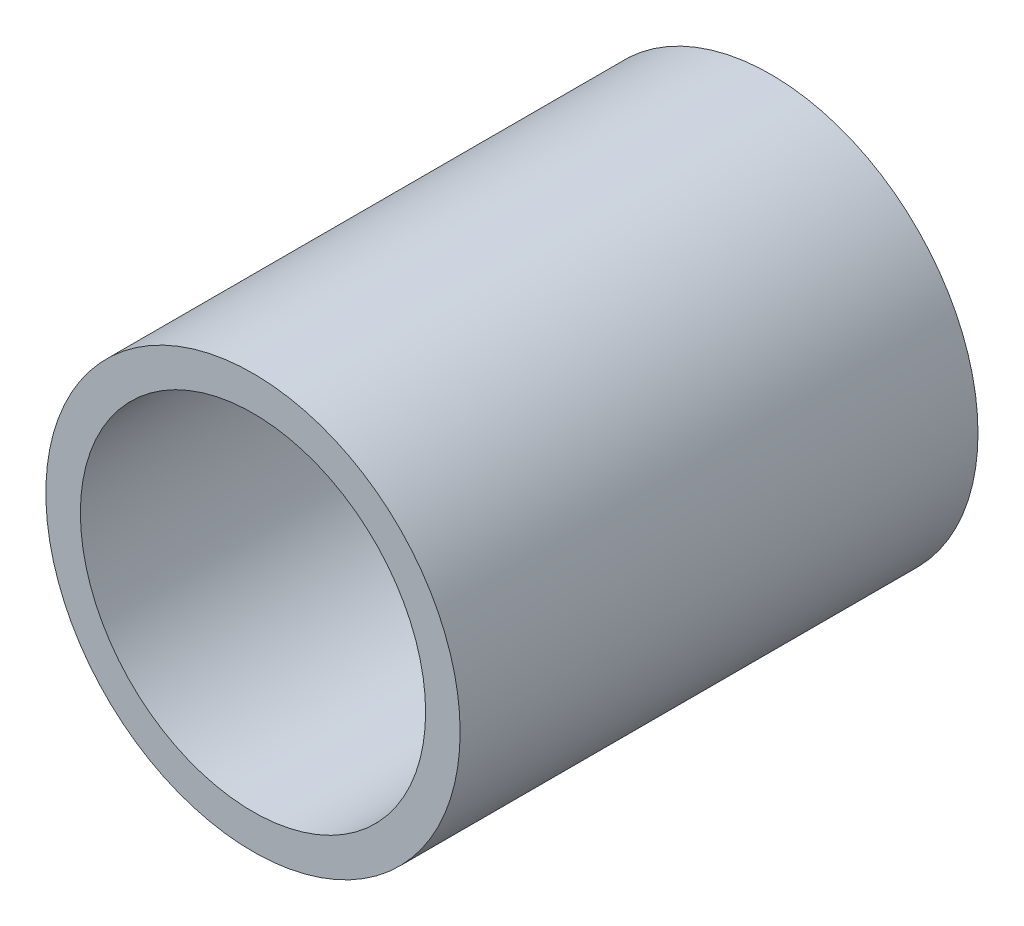
ISO-10303-21;
HEADER;
FILE_DESCRIPTION(('STEP AP214'),'2;1');
FILE_NAME('part.step','',(''),(''),'','','');
FILE_SCHEMA(('AUTOMOTIVE_DESIGN { 1 0 10303 214 1 1 1 1 }'));
ENDSEC;
DATA;
#1=APPLICATION_CONTEXT('core data for automotive mechanical design processes');
#2=APPLICATION_PROTOCOL_DEFINITION('international standard','automotive_design',2000,#1);
#3=PRODUCT_CONTEXT('',#1,'mechanical');
#4=PRODUCT('Part','Part','',(#3));
#5=PRODUCT_RELATED_PRODUCT_CATEGORY('part','',(#4));
#6=PRODUCT_DEFINITION_FORMATION('','',#4);
#7=PRODUCT_DEFINITION_CONTEXT('part definition',#1,'design');
#8=PRODUCT_DEFINITION('design','',#6,#7);
#9=PRODUCT_DEFINITION_SHAPE('','',#8);
#10=(LENGTH_UNIT() NAMED_UNIT(*) SI_UNIT(.MILLI.,.METRE.));
#11=(NAMED_UNIT(*) PLANE_ANGLE_UNIT() SI_UNIT($,.RADIAN.));
#12=(NAMED_UNIT(*) SI_UNIT($,.STERADIAN.) SOLID_ANGLE_UNIT());
#13=UNCERTAINTY_MEASURE_WITH_UNIT(LENGTH_MEASURE(1.E-05),#10,'distance_accuracy_value','');
#14=(GEOMETRIC_REPRESENTATION_CONTEXT(3) GLOBAL_UNCERTAINTY_ASSIGNED_CONTEXT((#13)) GLOBAL_UNIT_ASSIGNED_CONTEXT((#10,
#11,#12)) REPRESENTATION_CONTEXT('',''));
#15=CARTESIAN_POINT('',(0.,0.,0.));
#16=DIRECTION('',(0.,0.,1.));
#17=DIRECTION('',(1.,0.,0.));
#18=AXIS2_PLACEMENT_3D('',#15,#16,#17);
#19=CARTESIAN_POINT('',(0.,0.,23.8125));
#20=DIRECTION('',(0.,0.,1.));
#21=DIRECTION('',(1.,0.,0.));
#22=AXIS2_PLACEMENT_3D('',#19,#20,#21);
#23=PLANE('',#22);
#24=CARTESIAN_POINT('',(0.,0.,23.8125));
#25=DIRECTION('',(0.,0.,1.));
#26=DIRECTION('',(1.,0.,0.));
#27=AXIS2_PLACEMENT_3D('',#24,#25,#26);
#28=CIRCLE('',#27,9.525);
#29=CARTESIAN_POINT('',(9.525,0.,23.8125));
#30=VERTEX_POINT('',#29);
#31=EDGE_CURVE('E10',#30,#30,#28,.T.);
#32=ORIENTED_EDGE('',*,*,#31,.T.);
#33=EDGE_LOOP('',(#32));
#34=FACE_BOUND('',#33,.T.);
#35=CARTESIAN_POINT('',(0.,0.,23.8125));
#36=DIRECTION('',(0.,0.,1.));
#37=DIRECTION('',(1.,0.,0.));
#38=AXIS2_PLACEMENT_3D('',#35,#36,#37);
#39=CIRCLE('',#38,7.9375);
#40=CARTESIAN_POINT('',(7.9375,0.,23.8125));
#41=VERTEX_POINT('',#40);
#42=EDGE_CURVE('E42',#41,#41,#39,.T.);
#43=ORIENTED_EDGE('',*,*,#42,.F.);
#44=EDGE_LOOP('',(#43));
#45=FACE_BOUND('',#44,.T.);
#46=ADVANCED_FACE('F31',(#34,#45),#23,.T.);
#47=CARTESIAN_POINT('',(0.,0.,0.));
#48=DIRECTION('',(0.,0.,1.));
#49=DIRECTION('',(1.,0.,0.));
#50=AXIS2_PLACEMENT_3D('',#47,#48,#49);
#51=PLANE('',#50);
#52=CARTESIAN_POINT('',(0.,0.,0.));
#53=DIRECTION('',(0.,0.,1.));
#54=DIRECTION('',(1.,0.,0.));
#55=AXIS2_PLACEMENT_3D('',#52,#53,#54);
#56=CIRCLE('',#55,9.525);
#57=CARTESIAN_POINT('',(9.525,0.,0.));
#58=VERTEX_POINT('',#57);
#59=EDGE_CURVE('E35',#58,#58,#56,.T.);
#60=ORIENTED_EDGE('',*,*,#59,.F.);
#61=EDGE_LOOP('',(#60));
#62=FACE_BOUND('',#61,.T.);
#63=CARTESIAN_POINT('',(0.,0.,0.));
#64=DIRECTION('',(0.,0.,1.));
#65=DIRECTION('',(1.,0.,0.));
#66=AXIS2_PLACEMENT_3D('',#63,#64,#65);
#67=CIRCLE('',#66,7.9375);
#68=CARTESIAN_POINT('',(7.9375,0.,0.));
#69=VERTEX_POINT('',#68);
#70=EDGE_CURVE('E44',#69,#69,#67,.T.);
#71=ORIENTED_EDGE('',*,*,#70,.T.);
#72=EDGE_LOOP('',(#71));
#73=FACE_BOUND('',#72,.T.);
#74=ADVANCED_FACE('F54',(#62,#73),#51,.F.);
#75=CARTESIAN_POINT('',(0.,0.,23.8125));
#76=DIRECTION('',(0.,0.,-1.));
#77=DIRECTION('',(-1.,0.,0.));
#78=AXIS2_PLACEMENT_3D('',#75,#76,#77);
#79=CYLINDRICAL_SURFACE('',#78,9.525);
#80=ORIENTED_EDGE('',*,*,#31,.F.);
#81=EDGE_LOOP('',(#80));
#82=FACE_BOUND('',#81,.T.);
#83=ORIENTED_EDGE('',*,*,#59,.T.);
#84=EDGE_LOOP('',(#83));
#85=FACE_BOUND('',#84,.T.);
#86=ADVANCED_FACE('F33',(#82,#85),#79,.T.);
#87=CARTESIAN_POINT('',(0.,0.,23.8125));
#88=DIRECTION('',(0.,0.,-1.));
#89=DIRECTION('',(-1.,0.,0.));
#90=AXIS2_PLACEMENT_3D('',#87,#88,#89);
#91=CYLINDRICAL_SURFACE('',#90,7.9375);
#92=ORIENTED_EDGE('',*,*,#42,.T.);
#93=EDGE_LOOP('',(#92));
#94=FACE_BOUND('',#93,.T.);
#95=ORIENTED_EDGE('',*,*,#70,.F.);
#96=EDGE_LOOP('',(#95));
#97=FACE_BOUND('',#96,.T.);
#98=ADVANCED_FACE('F50',(#94,#97),#91,.F.);
#99=CLOSED_SHELL('',(#46,#74,#86,#98));
#100=MANIFOLD_SOLID_BREP('B2',#99);
#101=ADVANCED_BREP_SHAPE_REPRESENTATION('',(#18,#100),#14);
#102=SHAPE_DEFINITION_REPRESENTATION(#9,#101);
ENDSEC;
END-ISO-10303-21;
